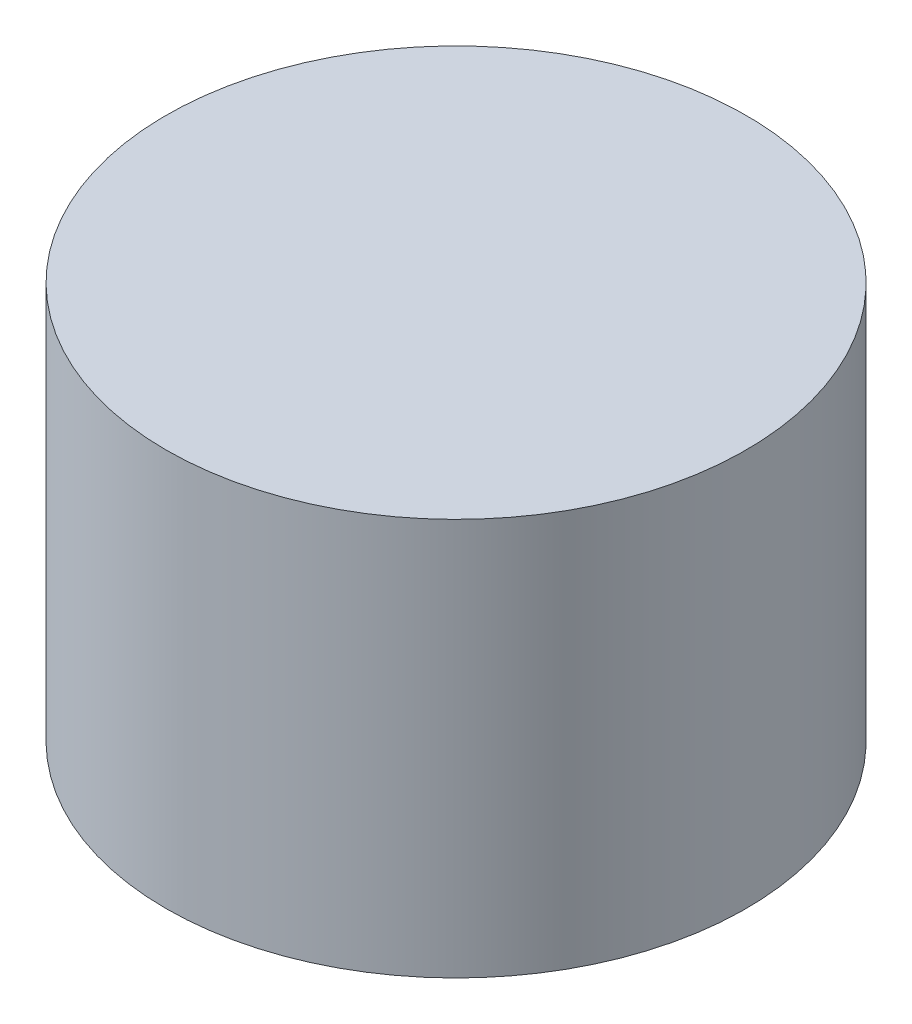
ISO-10303-21;
HEADER;
FILE_DESCRIPTION(('STEP AP214'),'2;1');
FILE_NAME('part.step','',(''),(''),'','','');
FILE_SCHEMA(('AUTOMOTIVE_DESIGN { 1 0 10303 214 1 1 1 1 }'));
ENDSEC;
DATA;
#1=APPLICATION_CONTEXT('core data for automotive mechanical design processes');
#2=APPLICATION_PROTOCOL_DEFINITION('international standard','automotive_design',2000,#1);
#3=PRODUCT_CONTEXT('',#1,'mechanical');
#4=PRODUCT('Part','Part','',(#3));
#5=PRODUCT_RELATED_PRODUCT_CATEGORY('part','',(#4));
#6=PRODUCT_DEFINITION_FORMATION('','',#4);
#7=PRODUCT_DEFINITION_CONTEXT('part definition',#1,'design');
#8=PRODUCT_DEFINITION('design','',#6,#7);
#9=PRODUCT_DEFINITION_SHAPE('','',#8);
#10=(LENGTH_UNIT() NAMED_UNIT(*) SI_UNIT(.MILLI.,.METRE.));
#11=(NAMED_UNIT(*) PLANE_ANGLE_UNIT() SI_UNIT($,.RADIAN.));
#12=(NAMED_UNIT(*) SI_UNIT($,.STERADIAN.) SOLID_ANGLE_UNIT());
#13=UNCERTAINTY_MEASURE_WITH_UNIT(LENGTH_MEASURE(1.E-05),#10,'distance_accuracy_value','');
#14=(GEOMETRIC_REPRESENTATION_CONTEXT(3) GLOBAL_UNCERTAINTY_ASSIGNED_CONTEXT((#13)) GLOBAL_UNIT_ASSIGNED_CONTEXT((#10,
#11,#12)) REPRESENTATION_CONTEXT('',''));
#15=CARTESIAN_POINT('',(0.,0.,0.));
#16=DIRECTION('',(0.,0.,1.));
#17=DIRECTION('',(1.,0.,0.));
#18=AXIS2_PLACEMENT_3D('',#15,#16,#17);
#19=CARTESIAN_POINT('',(0.,0.5,0.));
#20=DIRECTION('',(0.,-1.,0.));
#21=DIRECTION('',(0.,0.,-1.));
#22=AXIS2_PLACEMENT_3D('',#19,#20,#21);
#23=CYLINDRICAL_SURFACE('',#22,0.365);
#24=CARTESIAN_POINT('',(0.,0.5,0.));
#25=DIRECTION('',(0.,1.,0.));
#26=DIRECTION('',(0.,0.,1.));
#27=AXIS2_PLACEMENT_3D('',#24,#25,#26);
#28=CIRCLE('',#27,0.365);
#29=CARTESIAN_POINT('',(0.,0.5,0.365));
#30=VERTEX_POINT('',#29);
#31=EDGE_CURVE('E10',#30,#30,#28,.T.);
#32=ORIENTED_EDGE('',*,*,#31,.F.);
#33=EDGE_LOOP('',(#32));
#34=FACE_BOUND('',#33,.T.);
#35=CARTESIAN_POINT('',(0.,0.,0.));
#36=DIRECTION('',(0.,1.,0.));
#37=DIRECTION('',(0.,0.,1.));
#38=AXIS2_PLACEMENT_3D('',#35,#36,#37);
#39=CIRCLE('',#38,0.365);
#40=CARTESIAN_POINT('',(0.,0.,0.365));
#41=VERTEX_POINT('',#40);
#42=EDGE_CURVE('E34',#41,#41,#39,.T.);
#43=ORIENTED_EDGE('',*,*,#42,.T.);
#44=EDGE_LOOP('',(#43));
#45=FACE_BOUND('',#44,.T.);
#46=ADVANCED_FACE('F31',(#34,#45),#23,.T.);
#47=CARTESIAN_POINT('',(0.,0.5,0.));
#48=DIRECTION('',(0.,1.,0.));
#49=DIRECTION('',(0.,0.,1.));
#50=AXIS2_PLACEMENT_3D('',#47,#48,#49);
#51=PLANE('',#50);
#52=ORIENTED_EDGE('',*,*,#31,.T.);
#53=EDGE_LOOP('',(#52));
#54=FACE_BOUND('',#53,.T.);
#55=ADVANCED_FACE('F46',(#54),#51,.T.);
#56=CARTESIAN_POINT('',(0.,0.,0.));
#57=DIRECTION('',(0.,1.,0.));
#58=DIRECTION('',(0.,0.,1.));
#59=AXIS2_PLACEMENT_3D('',#56,#57,#58);
#60=PLANE('',#59);
#61=ORIENTED_EDGE('',*,*,#42,.F.);
#62=EDGE_LOOP('',(#61));
#63=FACE_BOUND('',#62,.T.);
#64=ADVANCED_FACE('F44',(#63),#60,.F.);
#65=CLOSED_SHELL('',(#46,#55,#64));
#66=MANIFOLD_SOLID_BREP('B2',#65);
#67=ADVANCED_BREP_SHAPE_REPRESENTATION('',(#18,#66),#14);
#68=SHAPE_DEFINITION_REPRESENTATION(#9,#67);
ENDSEC;
END-ISO-10303-21;
